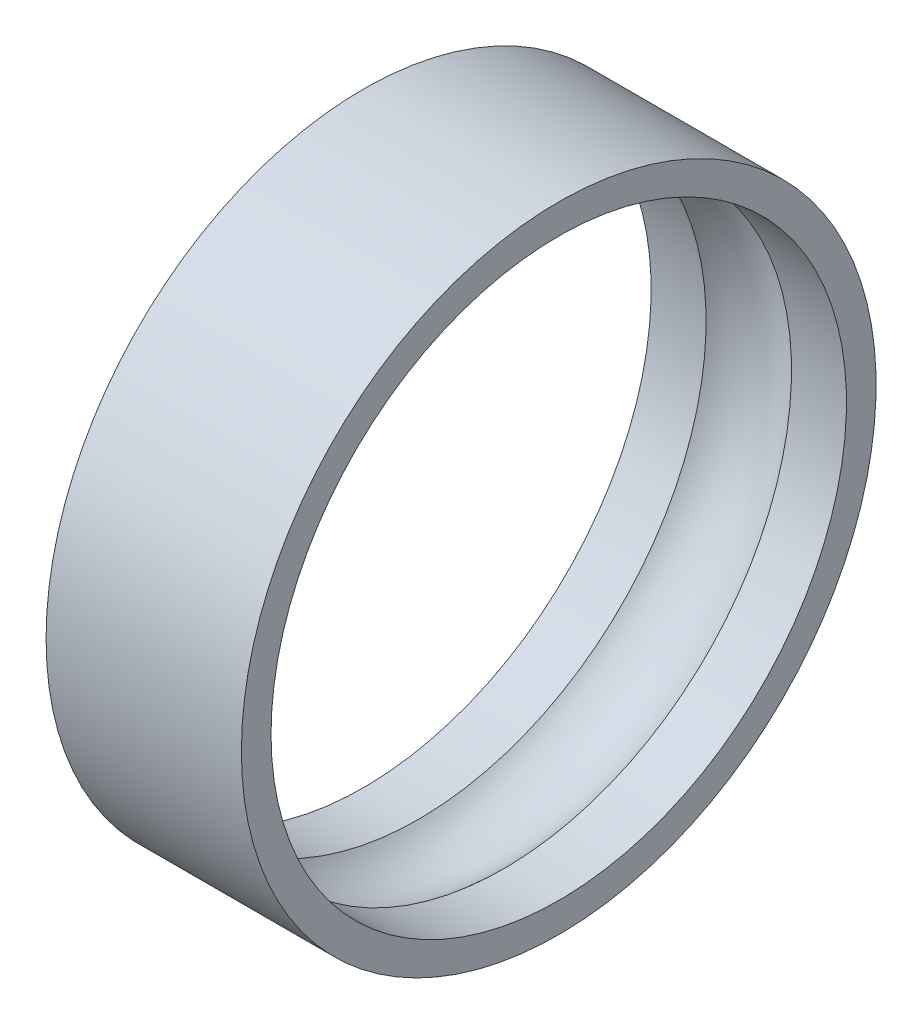
ISO-10303-21;
HEADER;
FILE_DESCRIPTION(('STEP AP214'),'2;1');
FILE_NAME('part.step','',(''),(''),'','','');
FILE_SCHEMA(('AUTOMOTIVE_DESIGN { 1 0 10303 214 1 1 1 1 }'));
ENDSEC;
DATA;
#1=APPLICATION_CONTEXT('core data for automotive mechanical design processes');
#2=APPLICATION_PROTOCOL_DEFINITION('international standard','automotive_design',2000,#1);
#3=PRODUCT_CONTEXT('',#1,'mechanical');
#4=PRODUCT('Part','Part','',(#3));
#5=PRODUCT_RELATED_PRODUCT_CATEGORY('part','',(#4));
#6=PRODUCT_DEFINITION_FORMATION('','',#4);
#7=PRODUCT_DEFINITION_CONTEXT('part definition',#1,'design');
#8=PRODUCT_DEFINITION('design','',#6,#7);
#9=PRODUCT_DEFINITION_SHAPE('','',#8);
#10=(LENGTH_UNIT() NAMED_UNIT(*) SI_UNIT(.MILLI.,.METRE.));
#11=(NAMED_UNIT(*) PLANE_ANGLE_UNIT() SI_UNIT($,.RADIAN.));
#12=(NAMED_UNIT(*) SI_UNIT($,.STERADIAN.) SOLID_ANGLE_UNIT());
#13=UNCERTAINTY_MEASURE_WITH_UNIT(LENGTH_MEASURE(1.E-05),#10,'distance_accuracy_value','');
#14=(GEOMETRIC_REPRESENTATION_CONTEXT(3) GLOBAL_UNCERTAINTY_ASSIGNED_CONTEXT((#13)) GLOBAL_UNIT_ASSIGNED_CONTEXT((#10,
#11,#12)) REPRESENTATION_CONTEXT('',''));
#15=CARTESIAN_POINT('',(0.,0.,0.));
#16=DIRECTION('',(0.,0.,1.));
#17=DIRECTION('',(1.,0.,0.));
#18=AXIS2_PLACEMENT_3D('',#15,#16,#17);
#19=CARTESIAN_POINT('',(0.,10.,0.));
#20=DIRECTION('',(-1.,0.,0.));
#21=DIRECTION('',(0.,0.,1.));
#22=AXIS2_PLACEMENT_3D('',#19,#20,#21);
#23=TOROIDAL_SURFACE('',#22,10.,2.5);
#24=CARTESIAN_POINT('',(1.74999999999992,10.,0.));
#25=DIRECTION('',(-1.,0.,0.));
#26=DIRECTION('',(0.,0.,1.));
#27=AXIS2_PLACEMENT_3D('',#24,#25,#26);
#28=CIRCLE('',#27,11.7853571071357);
#29=CARTESIAN_POINT('',(1.74999999999992,10.,11.7853571071357));
#30=VERTEX_POINT('',#29);
#31=EDGE_CURVE('E55',#30,#30,#28,.T.);
#32=ORIENTED_EDGE('',*,*,#31,.F.);
#33=EDGE_LOOP('',(#32));
#34=FACE_BOUND('',#33,.T.);
#35=CARTESIAN_POINT('',(-1.74999999999992,10.,0.));
#36=DIRECTION('',(-1.,0.,0.));
#37=DIRECTION('',(0.,0.,1.));
#38=AXIS2_PLACEMENT_3D('',#35,#36,#37);
#39=CIRCLE('',#38,11.7853571071357);
#40=CARTESIAN_POINT('',(-1.74999999999992,10.,11.7853571071357));
#41=VERTEX_POINT('',#40);
#42=EDGE_CURVE('E10',#41,#41,#39,.T.);
#43=ORIENTED_EDGE('',*,*,#42,.T.);
#44=EDGE_LOOP('',(#43));
#45=FACE_BOUND('',#44,.T.);
#46=ADVANCED_FACE('F33',(#34,#45),#23,.F.);
#47=CARTESIAN_POINT('',(-1011.10034761684,10.,0.));
#48=DIRECTION('',(-1.,0.,0.));
#49=DIRECTION('',(0.,0.,1.));
#50=AXIS2_PLACEMENT_3D('',#47,#48,#49);
#51=CYLINDRICAL_SURFACE('',#50,11.7853571071357);
#52=CARTESIAN_POINT('',(-4.,10.,0.));
#53=DIRECTION('',(-1.,0.,0.));
#54=DIRECTION('',(0.,0.,1.));
#55=AXIS2_PLACEMENT_3D('',#52,#53,#54);
#56=CIRCLE('',#55,11.7853571071357);
#57=CARTESIAN_POINT('',(-4.,10.,11.7853571071357));
#58=VERTEX_POINT('',#57);
#59=EDGE_CURVE('E39',#58,#58,#56,.T.);
#60=ORIENTED_EDGE('',*,*,#59,.T.);
#61=EDGE_LOOP('',(#60));
#62=FACE_BOUND('',#61,.T.);
#63=ORIENTED_EDGE('',*,*,#42,.F.);
#64=EDGE_LOOP('',(#63));
#65=FACE_BOUND('',#64,.T.);
#66=ADVANCED_FACE('F63',(#62,#65),#51,.F.);
#67=CARTESIAN_POINT('',(-4.,0.,0.));
#68=DIRECTION('',(-1.,0.,0.));
#69=DIRECTION('',(0.,0.,1.));
#70=AXIS2_PLACEMENT_3D('',#67,#68,#69);
#71=PLANE('',#70);
#72=CARTESIAN_POINT('',(-4.,10.,0.));
#73=DIRECTION('',(-1.,0.,0.));
#74=DIRECTION('',(0.,0.,1.));
#75=AXIS2_PLACEMENT_3D('',#72,#73,#74);
#76=CIRCLE('',#75,13.);
#77=CARTESIAN_POINT('',(-4.,10.,13.));
#78=VERTEX_POINT('',#77);
#79=EDGE_CURVE('E43',#78,#78,#76,.T.);
#80=ORIENTED_EDGE('',*,*,#79,.T.);
#81=EDGE_LOOP('',(#80));
#82=FACE_BOUND('',#81,.T.);
#83=ORIENTED_EDGE('',*,*,#59,.F.);
#84=EDGE_LOOP('',(#83));
#85=FACE_BOUND('',#84,.T.);
#86=ADVANCED_FACE('F67',(#82,#85),#71,.T.);
#87=CARTESIAN_POINT('',(-1011.10034761684,10.,0.));
#88=DIRECTION('',(-1.,0.,0.));
#89=DIRECTION('',(0.,0.,1.));
#90=AXIS2_PLACEMENT_3D('',#87,#88,#89);
#91=CYLINDRICAL_SURFACE('',#90,13.);
#92=CARTESIAN_POINT('',(4.,10.,0.));
#93=DIRECTION('',(-1.,0.,0.));
#94=DIRECTION('',(0.,0.,1.));
#95=AXIS2_PLACEMENT_3D('',#92,#93,#94);
#96=CIRCLE('',#95,13.);
#97=CARTESIAN_POINT('',(4.,10.,13.));
#98=VERTEX_POINT('',#97);
#99=EDGE_CURVE('E47',#98,#98,#96,.T.);
#100=ORIENTED_EDGE('',*,*,#99,.T.);
#101=EDGE_LOOP('',(#100));
#102=FACE_BOUND('',#101,.T.);
#103=ORIENTED_EDGE('',*,*,#79,.F.);
#104=EDGE_LOOP('',(#103));
#105=FACE_BOUND('',#104,.T.);
#106=ADVANCED_FACE('F71',(#102,#105),#91,.T.);
#107=CARTESIAN_POINT('',(4.,0.,0.));
#108=DIRECTION('',(1.,0.,0.));
#109=DIRECTION('',(0.,0.,-1.));
#110=AXIS2_PLACEMENT_3D('',#107,#108,#109);
#111=PLANE('',#110);
#112=CARTESIAN_POINT('',(4.,10.,0.));
#113=DIRECTION('',(-1.,0.,0.));
#114=DIRECTION('',(0.,0.,1.));
#115=AXIS2_PLACEMENT_3D('',#112,#113,#114);
#116=CIRCLE('',#115,11.7853571071357);
#117=CARTESIAN_POINT('',(4.,10.,11.7853571071357));
#118=VERTEX_POINT('',#117);
#119=EDGE_CURVE('E52',#118,#118,#116,.T.);
#120=ORIENTED_EDGE('',*,*,#119,.T.);
#121=EDGE_LOOP('',(#120));
#122=FACE_BOUND('',#121,.T.);
#123=ORIENTED_EDGE('',*,*,#99,.F.);
#124=EDGE_LOOP('',(#123));
#125=FACE_BOUND('',#124,.T.);
#126=ADVANCED_FACE('F78',(#122,#125),#111,.T.);
#127=CARTESIAN_POINT('',(-1011.10034761684,10.,0.));
#128=DIRECTION('',(-1.,0.,0.));
#129=DIRECTION('',(0.,0.,1.));
#130=AXIS2_PLACEMENT_3D('',#127,#128,#129);
#131=CYLINDRICAL_SURFACE('',#130,11.7853571071357);
#132=ORIENTED_EDGE('',*,*,#31,.T.);
#133=EDGE_LOOP('',(#132));
#134=FACE_BOUND('',#133,.T.);
#135=ORIENTED_EDGE('',*,*,#119,.F.);
#136=EDGE_LOOP('',(#135));
#137=FACE_BOUND('',#136,.T.);
#138=ADVANCED_FACE('F59',(#134,#137),#131,.F.);
#139=CLOSED_SHELL('',(#46,#66,#86,#106,#126,#138));
#140=MANIFOLD_SOLID_BREP('B2',#139);
#141=ADVANCED_BREP_SHAPE_REPRESENTATION('',(#18,#140),#14);
#142=SHAPE_DEFINITION_REPRESENTATION(#9,#141);
ENDSEC;
END-ISO-10303-21;
